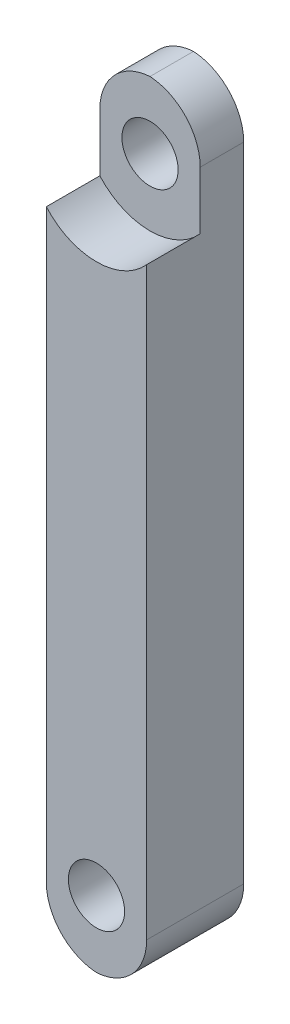
ISO-10303-21;
HEADER;
FILE_DESCRIPTION(('STEP AP214'),'2;1');
FILE_NAME('part.step','',(''),(''),'','','');
FILE_SCHEMA(('AUTOMOTIVE_DESIGN { 1 0 10303 214 1 1 1 1 }'));
ENDSEC;
DATA;
#1=APPLICATION_CONTEXT('core data for automotive mechanical design processes');
#2=APPLICATION_PROTOCOL_DEFINITION('international standard','automotive_design',2000,#1);
#3=PRODUCT_CONTEXT('',#1,'mechanical');
#4=PRODUCT('Part','Part','',(#3));
#5=PRODUCT_RELATED_PRODUCT_CATEGORY('part','',(#4));
#6=PRODUCT_DEFINITION_FORMATION('','',#4);
#7=PRODUCT_DEFINITION_CONTEXT('part definition',#1,'design');
#8=PRODUCT_DEFINITION('design','',#6,#7);
#9=PRODUCT_DEFINITION_SHAPE('','',#8);
#10=(LENGTH_UNIT() NAMED_UNIT(*) SI_UNIT(.MILLI.,.METRE.));
#11=(NAMED_UNIT(*) PLANE_ANGLE_UNIT() SI_UNIT($,.RADIAN.));
#12=(NAMED_UNIT(*) SI_UNIT($,.STERADIAN.) SOLID_ANGLE_UNIT());
#13=UNCERTAINTY_MEASURE_WITH_UNIT(LENGTH_MEASURE(1.E-05),#10,'distance_accuracy_value','');
#14=(GEOMETRIC_REPRESENTATION_CONTEXT(3) GLOBAL_UNCERTAINTY_ASSIGNED_CONTEXT((#13)) GLOBAL_UNIT_ASSIGNED_CONTEXT((#10,
#11,#12)) REPRESENTATION_CONTEXT('',''));
#15=CARTESIAN_POINT('',(0.,0.,0.));
#16=DIRECTION('',(0.,0.,1.));
#17=DIRECTION('',(1.,0.,0.));
#18=AXIS2_PLACEMENT_3D('',#15,#16,#17);
#19=CARTESIAN_POINT('',(0.,29.21,9.2075));
#20=DIRECTION('',(0.,0.,-1.));
#21=DIRECTION('',(-1.,0.,0.));
#22=AXIS2_PLACEMENT_3D('',#19,#20,#21);
#23=CYLINDRICAL_SURFACE('',#22,2.667);
#24=CARTESIAN_POINT('',(0.,29.21,0.));
#25=DIRECTION('',(0.,0.,1.));
#26=DIRECTION('',(1.,0.,0.));
#27=AXIS2_PLACEMENT_3D('',#24,#25,#26);
#28=CIRCLE('',#27,2.667);
#29=CARTESIAN_POINT('',(2.667,29.21,0.));
#30=VERTEX_POINT('',#29);
#31=EDGE_CURVE('E164',#30,#30,#28,.T.);
#32=ORIENTED_EDGE('',*,*,#31,.F.);
#33=EDGE_LOOP('',(#32));
#34=FACE_BOUND('',#33,.T.);
#35=CARTESIAN_POINT('',(0.,29.21,4.1275));
#36=DIRECTION('',(0.,0.,1.));
#37=DIRECTION('',(1.,0.,0.));
#38=AXIS2_PLACEMENT_3D('',#35,#36,#37);
#39=CIRCLE('',#38,2.667);
#40=CARTESIAN_POINT('',(2.667,29.21,4.1275));
#41=VERTEX_POINT('',#40);
#42=EDGE_CURVE('E199',#41,#41,#39,.T.);
#43=ORIENTED_EDGE('',*,*,#42,.T.);
#44=EDGE_LOOP('',(#43));
#45=FACE_BOUND('',#44,.T.);
#46=ADVANCED_FACE('F47',(#34,#45),#23,.F.);
#47=CARTESIAN_POINT('',(0.317499999999996,30.48,9.2075));
#48=DIRECTION('',(0.,0.,-1.));
#49=DIRECTION('',(-1.,0.,0.));
#50=AXIS2_PLACEMENT_3D('',#47,#48,#49);
#51=CYLINDRICAL_SURFACE('',#50,5.08);
#52=DIRECTION('',(0.,0.,-1.));
#53=VECTOR('',#52,1.);
#54=CARTESIAN_POINT('',(-4.7625,30.48,9.2075));
#55=LINE('',#54,#53);
#56=CARTESIAN_POINT('',(-4.7625,30.48,4.1275));
#57=VERTEX_POINT('',#56);
#58=CARTESIAN_POINT('',(-4.7625,30.48,0.));
#59=VERTEX_POINT('',#58);
#60=EDGE_CURVE('E150',#57,#59,#55,.T.);
#61=ORIENTED_EDGE('',*,*,#60,.F.);
#62=CARTESIAN_POINT('',(0.317499999999996,30.48,4.1275));
#63=DIRECTION('',(0.,0.,1.));
#64=DIRECTION('',(1.,0.,0.));
#65=AXIS2_PLACEMENT_3D('',#62,#63,#64);
#66=CIRCLE('',#65,5.08);
#67=CARTESIAN_POINT('',(0.,35.5500684166981,4.1275));
#68=VERTEX_POINT('',#67);
#69=EDGE_CURVE('E193',#57,#68,#66,.F.);
#70=ORIENTED_EDGE('',*,*,#69,.T.);
#71=DIRECTION('',(0.,0.,-1.));
#72=VECTOR('',#71,1.);
#73=CARTESIAN_POINT('',(0.,35.5500684166981,4.60375));
#74=LINE('',#73,#72);
#75=CARTESIAN_POINT('',(0.,35.5500684166981,0.));
#76=VERTEX_POINT('',#75);
#77=EDGE_CURVE('E165',#76,#68,#74,.F.);
#78=ORIENTED_EDGE('',*,*,#77,.F.);
#79=CARTESIAN_POINT('',(0.317499999999996,30.48,0.));
#80=DIRECTION('',(0.,0.,1.));
#81=DIRECTION('',(1.,0.,0.));
#82=AXIS2_PLACEMENT_3D('',#79,#80,#81);
#83=CIRCLE('',#82,5.08);
#84=EDGE_CURVE('E132',#59,#76,#83,.F.);
#85=ORIENTED_EDGE('',*,*,#84,.F.);
#86=EDGE_LOOP('',(#61,#70,#78,#85));
#87=FACE_BOUND('',#86,.T.);
#88=ADVANCED_FACE('F49',(#87),#51,.T.);
#89=CARTESIAN_POINT('',(-0.317500000000004,30.48,9.2075));
#90=DIRECTION('',(0.,0.,-1.));
#91=DIRECTION('',(-1.,0.,0.));
#92=AXIS2_PLACEMENT_3D('',#89,#90,#91);
#93=CYLINDRICAL_SURFACE('',#92,5.08);
#94=ORIENTED_EDGE('',*,*,#77,.T.);
#95=CARTESIAN_POINT('',(-0.317500000000004,30.48,4.1275));
#96=DIRECTION('',(0.,0.,1.));
#97=DIRECTION('',(1.,0.,0.));
#98=AXIS2_PLACEMENT_3D('',#95,#96,#97);
#99=CIRCLE('',#98,5.08);
#100=CARTESIAN_POINT('',(4.7625,30.48,4.1275));
#101=VERTEX_POINT('',#100);
#102=EDGE_CURVE('E55',#68,#101,#99,.F.);
#103=ORIENTED_EDGE('',*,*,#102,.T.);
#104=DIRECTION('',(0.,0.,-1.));
#105=VECTOR('',#104,1.);
#106=CARTESIAN_POINT('',(4.7625,30.48,9.2075));
#107=LINE('',#106,#105);
#108=CARTESIAN_POINT('',(4.7625,30.48,0.));
#109=VERTEX_POINT('',#108);
#110=EDGE_CURVE('E156',#109,#101,#107,.F.);
#111=ORIENTED_EDGE('',*,*,#110,.F.);
#112=CARTESIAN_POINT('',(-0.317500000000004,30.48,0.));
#113=DIRECTION('',(0.,0.,1.));
#114=DIRECTION('',(1.,0.,0.));
#115=AXIS2_PLACEMENT_3D('',#112,#113,#114);
#116=CIRCLE('',#115,5.08);
#117=EDGE_CURVE('E134',#76,#109,#116,.F.);
#118=ORIENTED_EDGE('',*,*,#117,.F.);
#119=EDGE_LOOP('',(#94,#103,#111,#118));
#120=FACE_BOUND('',#119,.T.);
#121=ADVANCED_FACE('F170',(#120),#93,.T.);
#122=CARTESIAN_POINT('',(0.,0.,9.2075));
#123=DIRECTION('',(0.,0.,1.));
#124=DIRECTION('',(1.,0.,0.));
#125=AXIS2_PLACEMENT_3D('',#122,#123,#124);
#126=PLANE('',#125);
#127=CARTESIAN_POINT('',(0.,29.21,9.2075));
#128=DIRECTION('',(0.,0.,1.));
#129=DIRECTION('',(1.,0.,0.));
#130=AXIS2_PLACEMENT_3D('',#127,#128,#129);
#131=CIRCLE('',#130,6.35);
#132=CARTESIAN_POINT('',(-4.7625,25.009869793685,9.2075));
#133=VERTEX_POINT('',#132);
#134=CARTESIAN_POINT('',(4.7625,25.009869793685,9.2075));
#135=VERTEX_POINT('',#134);
#136=EDGE_CURVE('E114',#133,#135,#131,.T.);
#137=ORIENTED_EDGE('',*,*,#136,.F.);
#138=DIRECTION('',(0.,-1.,0.));
#139=VECTOR('',#138,1.);
#140=CARTESIAN_POINT('',(-4.7625,35.56,9.2075));
#141=LINE('',#140,#139);
#142=CARTESIAN_POINT('',(-4.7625,-30.48,9.2075));
#143=VERTEX_POINT('',#142);
#144=EDGE_CURVE('E123',#133,#143,#141,.T.);
#145=ORIENTED_EDGE('',*,*,#144,.T.);
#146=CARTESIAN_POINT('',(0.317500000000003,-30.48,9.2075));
#147=DIRECTION('',(0.,0.,1.));
#148=DIRECTION('',(1.,0.,0.));
#149=AXIS2_PLACEMENT_3D('',#146,#147,#148);
#150=CIRCLE('',#149,5.08);
#151=CARTESIAN_POINT('',(0.,-35.5500684166981,9.2075));
#152=VERTEX_POINT('',#151);
#153=EDGE_CURVE('E70',#143,#152,#150,.T.);
#154=ORIENTED_EDGE('',*,*,#153,.T.);
#155=CARTESIAN_POINT('',(-0.317499999999997,-30.48,9.2075));
#156=DIRECTION('',(0.,0.,1.));
#157=DIRECTION('',(1.,0.,0.));
#158=AXIS2_PLACEMENT_3D('',#155,#156,#157);
#159=CIRCLE('',#158,5.08);
#160=CARTESIAN_POINT('',(4.7625,-30.48,9.2075));
#161=VERTEX_POINT('',#160);
#162=EDGE_CURVE('E153',#152,#161,#159,.T.);
#163=ORIENTED_EDGE('',*,*,#162,.T.);
#164=DIRECTION('',(0.,1.,0.));
#165=VECTOR('',#164,1.);
#166=CARTESIAN_POINT('',(4.7625,35.56,9.2075));
#167=LINE('',#166,#165);
#168=EDGE_CURVE('E125',#161,#135,#167,.T.);
#169=ORIENTED_EDGE('',*,*,#168,.T.);
#170=EDGE_LOOP('',(#137,#145,#154,#163,#169));
#171=FACE_BOUND('',#170,.T.);
#172=CARTESIAN_POINT('',(0.,-29.21,9.2075));
#173=DIRECTION('',(0.,0.,1.));
#174=DIRECTION('',(1.,0.,0.));
#175=AXIS2_PLACEMENT_3D('',#172,#173,#174);
#176=CIRCLE('',#175,2.667);
#177=CARTESIAN_POINT('',(2.667,-29.21,9.2075));
#178=VERTEX_POINT('',#177);
#179=EDGE_CURVE('E143',#178,#178,#176,.T.);
#180=ORIENTED_EDGE('',*,*,#179,.F.);
#181=EDGE_LOOP('',(#180));
#182=FACE_BOUND('',#181,.T.);
#183=ADVANCED_FACE('F121',(#171,#182),#126,.T.);
#184=CARTESIAN_POINT('',(0.,0.,0.));
#185=DIRECTION('',(0.,0.,1.));
#186=DIRECTION('',(1.,0.,0.));
#187=AXIS2_PLACEMENT_3D('',#184,#185,#186);
#188=PLANE('',#187);
#189=CARTESIAN_POINT('',(-0.317499999999997,-30.48,0.));
#190=DIRECTION('',(0.,0.,1.));
#191=DIRECTION('',(1.,0.,0.));
#192=AXIS2_PLACEMENT_3D('',#189,#190,#191);
#193=CIRCLE('',#192,5.08);
#194=CARTESIAN_POINT('',(4.7625,-30.48,0.));
#195=VERTEX_POINT('',#194);
#196=CARTESIAN_POINT('',(0.,-35.5500684166981,0.));
#197=VERTEX_POINT('',#196);
#198=EDGE_CURVE('E146',#195,#197,#193,.F.);
#199=ORIENTED_EDGE('',*,*,#198,.T.);
#200=CARTESIAN_POINT('',(0.317500000000003,-30.48,0.));
#201=DIRECTION('',(0.,0.,1.));
#202=DIRECTION('',(1.,0.,0.));
#203=AXIS2_PLACEMENT_3D('',#200,#201,#202);
#204=CIRCLE('',#203,5.08);
#205=CARTESIAN_POINT('',(-4.7625,-30.48,0.));
#206=VERTEX_POINT('',#205);
#207=EDGE_CURVE('E148',#197,#206,#204,.F.);
#208=ORIENTED_EDGE('',*,*,#207,.T.);
#209=DIRECTION('',(0.,-1.,0.));
#210=VECTOR('',#209,1.);
#211=CARTESIAN_POINT('',(-4.7625,35.56,0.));
#212=LINE('',#211,#210);
#213=EDGE_CURVE('E136',#59,#206,#212,.T.);
#214=ORIENTED_EDGE('',*,*,#213,.F.);
#215=ORIENTED_EDGE('',*,*,#84,.T.);
#216=ORIENTED_EDGE('',*,*,#117,.T.);
#217=DIRECTION('',(0.,1.,0.));
#218=VECTOR('',#217,1.);
#219=CARTESIAN_POINT('',(4.7625,35.56,0.));
#220=LINE('',#219,#218);
#221=EDGE_CURVE('E140',#195,#109,#220,.T.);
#222=ORIENTED_EDGE('',*,*,#221,.F.);
#223=EDGE_LOOP('',(#199,#208,#214,#215,#216,#222));
#224=FACE_BOUND('',#223,.T.);
#225=CARTESIAN_POINT('',(0.,-29.21,0.));
#226=DIRECTION('',(0.,0.,1.));
#227=DIRECTION('',(1.,0.,0.));
#228=AXIS2_PLACEMENT_3D('',#225,#226,#227);
#229=CIRCLE('',#228,2.667);
#230=CARTESIAN_POINT('',(2.667,-29.21,0.));
#231=VERTEX_POINT('',#230);
#232=EDGE_CURVE('E206',#231,#231,#229,.T.);
#233=ORIENTED_EDGE('',*,*,#232,.T.);
#234=EDGE_LOOP('',(#233));
#235=FACE_BOUND('',#234,.T.);
#236=ORIENTED_EDGE('',*,*,#31,.T.);
#237=EDGE_LOOP('',(#236));
#238=FACE_BOUND('',#237,.T.);
#239=ADVANCED_FACE('F180',(#224,#235,#238),#188,.F.);
#240=CARTESIAN_POINT('',(4.7625,35.56,9.2075));
#241=DIRECTION('',(-1.,0.,0.));
#242=DIRECTION('',(0.,-1.,0.));
#243=AXIS2_PLACEMENT_3D('',#240,#241,#242);
#244=PLANE('',#243);
#245=DIRECTION('',(0.,1.,0.));
#246=VECTOR('',#245,1.);
#247=CARTESIAN_POINT('',(4.7625,35.56,4.1275));
#248=LINE('',#247,#246);
#249=CARTESIAN_POINT('',(4.7625,25.009869793685,4.1275));
#250=VERTEX_POINT('',#249);
#251=EDGE_CURVE('E62',#250,#101,#248,.T.);
#252=ORIENTED_EDGE('',*,*,#251,.F.);
#253=DIRECTION('',(0.,0.,1.));
#254=VECTOR('',#253,1.);
#255=CARTESIAN_POINT('',(4.7625,25.009869793685,4.1275));
#256=LINE('',#255,#254);
#257=EDGE_CURVE('E167',#250,#135,#256,.T.);
#258=ORIENTED_EDGE('',*,*,#257,.T.);
#259=ORIENTED_EDGE('',*,*,#168,.F.);
#260=DIRECTION('',(0.,0.,-1.));
#261=VECTOR('',#260,1.);
#262=CARTESIAN_POINT('',(4.7625,-30.48,9.2075));
#263=LINE('',#262,#261);
#264=EDGE_CURVE('E159',#161,#195,#263,.T.);
#265=ORIENTED_EDGE('',*,*,#264,.T.);
#266=ORIENTED_EDGE('',*,*,#221,.T.);
#267=ORIENTED_EDGE('',*,*,#110,.T.);
#268=EDGE_LOOP('',(#252,#258,#259,#265,#266,#267));
#269=FACE_BOUND('',#268,.T.);
#270=ADVANCED_FACE('F175',(#269),#244,.F.);
#271=CARTESIAN_POINT('',(-4.7625,35.56,9.2075));
#272=DIRECTION('',(1.,0.,0.));
#273=DIRECTION('',(0.,1.,0.));
#274=AXIS2_PLACEMENT_3D('',#271,#272,#273);
#275=PLANE('',#274);
#276=ORIENTED_EDGE('',*,*,#144,.F.);
#277=DIRECTION('',(0.,0.,1.));
#278=VECTOR('',#277,1.);
#279=CARTESIAN_POINT('',(-4.7625,25.009869793685,4.1275));
#280=LINE('',#279,#278);
#281=CARTESIAN_POINT('',(-4.7625,25.009869793685,4.1275));
#282=VERTEX_POINT('',#281);
#283=EDGE_CURVE('E11',#133,#282,#280,.F.);
#284=ORIENTED_EDGE('',*,*,#283,.T.);
#285=DIRECTION('',(0.,-1.,0.));
#286=VECTOR('',#285,1.);
#287=CARTESIAN_POINT('',(-4.7625,35.56,4.1275));
#288=LINE('',#287,#286);
#289=EDGE_CURVE('E191',#57,#282,#288,.T.);
#290=ORIENTED_EDGE('',*,*,#289,.F.);
#291=ORIENTED_EDGE('',*,*,#60,.T.);
#292=ORIENTED_EDGE('',*,*,#213,.T.);
#293=DIRECTION('',(0.,0.,-1.));
#294=VECTOR('',#293,1.);
#295=CARTESIAN_POINT('',(-4.7625,-30.48,9.2075));
#296=LINE('',#295,#294);
#297=EDGE_CURVE('E131',#206,#143,#296,.F.);
#298=ORIENTED_EDGE('',*,*,#297,.T.);
#299=EDGE_LOOP('',(#276,#284,#290,#291,#292,#298));
#300=FACE_BOUND('',#299,.T.);
#301=ADVANCED_FACE('F128',(#300),#275,.F.);
#302=CARTESIAN_POINT('',(0.,-29.21,9.2075));
#303=DIRECTION('',(0.,0.,-1.));
#304=DIRECTION('',(-1.,0.,0.));
#305=AXIS2_PLACEMENT_3D('',#302,#303,#304);
#306=CYLINDRICAL_SURFACE('',#305,2.667);
#307=ORIENTED_EDGE('',*,*,#179,.T.);
#308=EDGE_LOOP('',(#307));
#309=FACE_BOUND('',#308,.T.);
#310=ORIENTED_EDGE('',*,*,#232,.F.);
#311=EDGE_LOOP('',(#310));
#312=FACE_BOUND('',#311,.T.);
#313=ADVANCED_FACE('F213',(#309,#312),#306,.F.);
#314=CARTESIAN_POINT('',(-0.317499999999997,-30.48,9.2075));
#315=DIRECTION('',(0.,0.,-1.));
#316=DIRECTION('',(-1.,0.,0.));
#317=AXIS2_PLACEMENT_3D('',#314,#315,#316);
#318=CYLINDRICAL_SURFACE('',#317,5.08);
#319=ORIENTED_EDGE('',*,*,#264,.F.);
#320=ORIENTED_EDGE('',*,*,#162,.F.);
#321=DIRECTION('',(0.,0.,-1.));
#322=VECTOR('',#321,1.);
#323=CARTESIAN_POINT('',(0.,-35.5500684166981,4.60375));
#324=LINE('',#323,#322);
#325=EDGE_CURVE('E161',#197,#152,#324,.F.);
#326=ORIENTED_EDGE('',*,*,#325,.F.);
#327=ORIENTED_EDGE('',*,*,#198,.F.);
#328=EDGE_LOOP('',(#319,#320,#326,#327));
#329=FACE_BOUND('',#328,.T.);
#330=ADVANCED_FACE('F184',(#329),#318,.T.);
#331=CARTESIAN_POINT('',(0.317500000000003,-30.48,9.2075));
#332=DIRECTION('',(0.,0.,-1.));
#333=DIRECTION('',(-1.,0.,0.));
#334=AXIS2_PLACEMENT_3D('',#331,#332,#333);
#335=CYLINDRICAL_SURFACE('',#334,5.08);
#336=ORIENTED_EDGE('',*,*,#153,.F.);
#337=ORIENTED_EDGE('',*,*,#297,.F.);
#338=ORIENTED_EDGE('',*,*,#207,.F.);
#339=ORIENTED_EDGE('',*,*,#325,.T.);
#340=EDGE_LOOP('',(#336,#337,#338,#339));
#341=FACE_BOUND('',#340,.T.);
#342=ADVANCED_FACE('F187',(#341),#335,.T.);
#343=CARTESIAN_POINT('',(0.,29.21,4.1275));
#344=DIRECTION('',(0.,0.,1.));
#345=DIRECTION('',(1.,0.,0.));
#346=AXIS2_PLACEMENT_3D('',#343,#344,#345);
#347=CYLINDRICAL_SURFACE('',#346,6.35);
#348=CARTESIAN_POINT('',(0.,29.21,4.1275));
#349=DIRECTION('',(0.,0.,1.));
#350=DIRECTION('',(1.,0.,0.));
#351=AXIS2_PLACEMENT_3D('',#348,#349,#350);
#352=CIRCLE('',#351,6.35);
#353=EDGE_CURVE('E116',#282,#250,#352,.T.);
#354=ORIENTED_EDGE('',*,*,#353,.F.);
#355=ORIENTED_EDGE('',*,*,#283,.F.);
#356=ORIENTED_EDGE('',*,*,#136,.T.);
#357=ORIENTED_EDGE('',*,*,#257,.F.);
#358=EDGE_LOOP('',(#354,#355,#356,#357));
#359=FACE_BOUND('',#358,.T.);
#360=ADVANCED_FACE('F113',(#359),#347,.F.);
#361=CARTESIAN_POINT('',(0.,29.21,4.1275));
#362=DIRECTION('',(0.,0.,1.));
#363=DIRECTION('',(1.,0.,0.));
#364=AXIS2_PLACEMENT_3D('',#361,#362,#363);
#365=PLANE('',#364);
#366=ORIENTED_EDGE('',*,*,#42,.F.);
#367=EDGE_LOOP('',(#366));
#368=FACE_BOUND('',#367,.T.);
#369=ORIENTED_EDGE('',*,*,#251,.T.);
#370=ORIENTED_EDGE('',*,*,#102,.F.);
#371=ORIENTED_EDGE('',*,*,#69,.F.);
#372=ORIENTED_EDGE('',*,*,#289,.T.);
#373=ORIENTED_EDGE('',*,*,#353,.T.);
#374=EDGE_LOOP('',(#369,#370,#371,#372,#373));
#375=FACE_BOUND('',#374,.T.);
#376=ADVANCED_FACE('F235',(#368,#375),#365,.T.);
#377=CLOSED_SHELL('',(#46,#88,#121,#183,#239,#270,#301,#313,#330,#342,#360,#376));
#378=MANIFOLD_SOLID_BREP('B2',#377);
#379=ADVANCED_BREP_SHAPE_REPRESENTATION('',(#18,#378),#14);
#380=SHAPE_DEFINITION_REPRESENTATION(#9,#379);
ENDSEC;
END-ISO-10303-21;
